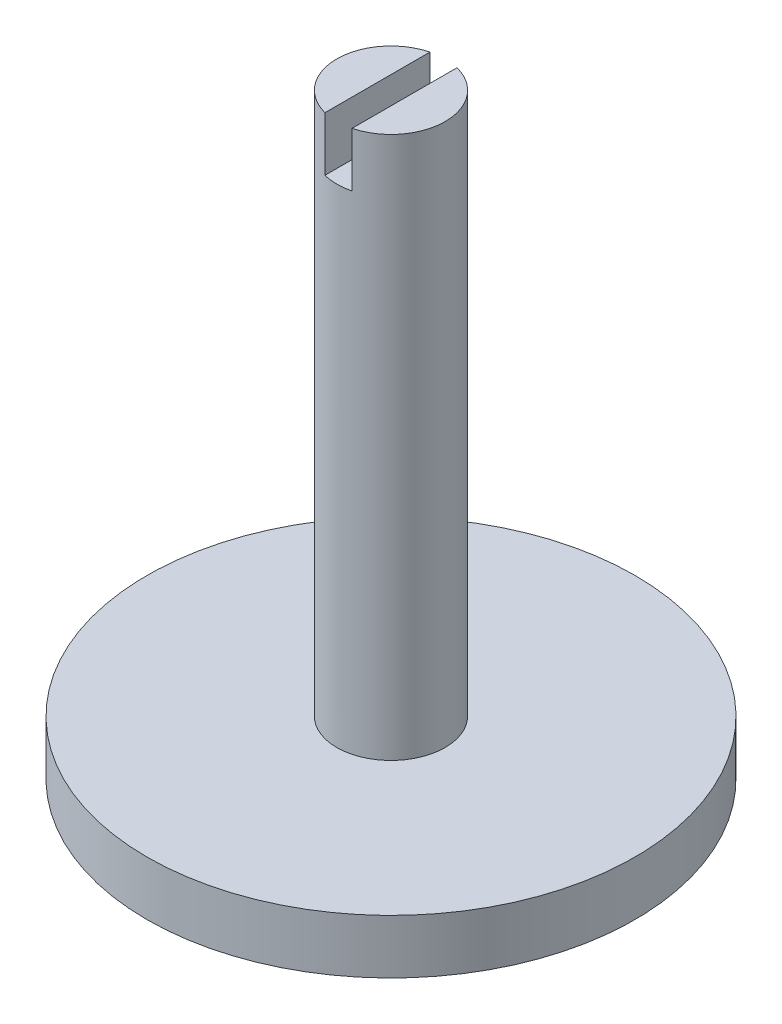
ISO-10303-21;
HEADER;
FILE_DESCRIPTION(('STEP AP214'),'2;1');
FILE_NAME('part.step','',(''),(''),'','','');
FILE_SCHEMA(('AUTOMOTIVE_DESIGN { 1 0 10303 214 1 1 1 1 }'));
ENDSEC;
DATA;
#1=APPLICATION_CONTEXT('core data for automotive mechanical design processes');
#2=APPLICATION_PROTOCOL_DEFINITION('international standard','automotive_design',2000,#1);
#3=PRODUCT_CONTEXT('',#1,'mechanical');
#4=PRODUCT('Part','Part','',(#3));
#5=PRODUCT_RELATED_PRODUCT_CATEGORY('part','',(#4));
#6=PRODUCT_DEFINITION_FORMATION('','',#4);
#7=PRODUCT_DEFINITION_CONTEXT('part definition',#1,'design');
#8=PRODUCT_DEFINITION('design','',#6,#7);
#9=PRODUCT_DEFINITION_SHAPE('','',#8);
#10=(LENGTH_UNIT() NAMED_UNIT(*) SI_UNIT(.MILLI.,.METRE.));
#11=(NAMED_UNIT(*) PLANE_ANGLE_UNIT() SI_UNIT($,.RADIAN.));
#12=(NAMED_UNIT(*) SI_UNIT($,.STERADIAN.) SOLID_ANGLE_UNIT());
#13=UNCERTAINTY_MEASURE_WITH_UNIT(LENGTH_MEASURE(1.E-05),#10,'distance_accuracy_value','');
#14=(GEOMETRIC_REPRESENTATION_CONTEXT(3) GLOBAL_UNCERTAINTY_ASSIGNED_CONTEXT((#13)) GLOBAL_UNIT_ASSIGNED_CONTEXT((#10,
#11,#12)) REPRESENTATION_CONTEXT('',''));
#15=CARTESIAN_POINT('',(0.,0.,0.));
#16=DIRECTION('',(0.,0.,1.));
#17=DIRECTION('',(1.,0.,0.));
#18=AXIS2_PLACEMENT_3D('',#15,#16,#17);
#19=CARTESIAN_POINT('',(0.,139.7,0.));
#20=DIRECTION('',(0.,1.,0.));
#21=DIRECTION('',(0.,0.,1.));
#22=AXIS2_PLACEMENT_3D('',#19,#20,#21);
#23=PLANE('',#22);
#24=DIRECTION('',(0.,0.,1.));
#25=VECTOR('',#24,1.);
#26=CARTESIAN_POINT('',(-3.175,139.7,0.));
#27=LINE('',#26,#25);
#28=CARTESIAN_POINT('',(-3.175,139.7,-12.2967221242086));
#29=VERTEX_POINT('',#28);
#30=CARTESIAN_POINT('',(-3.175,139.7,12.2967221242085));
#31=VERTEX_POINT('',#30);
#32=EDGE_CURVE('E60',#29,#31,#27,.T.);
#33=ORIENTED_EDGE('',*,*,#32,.F.);
#34=CARTESIAN_POINT('',(0.,139.7,0.));
#35=DIRECTION('',(0.,1.,0.));
#36=DIRECTION('',(0.,0.,1.));
#37=AXIS2_PLACEMENT_3D('',#34,#35,#36);
#38=CIRCLE('',#37,12.7);
#39=EDGE_CURVE('E109',#29,#31,#38,.T.);
#40=ORIENTED_EDGE('',*,*,#39,.T.);
#41=EDGE_LOOP('',(#33,#40));
#42=FACE_BOUND('',#41,.T.);
#43=ADVANCED_FACE('F37',(#42),#23,.T.);
#44=CARTESIAN_POINT('',(0.,12.7,0.));
#45=DIRECTION('',(0.,-1.,0.));
#46=DIRECTION('',(0.,0.,-1.));
#47=AXIS2_PLACEMENT_3D('',#44,#45,#46);
#48=CYLINDRICAL_SURFACE('',#47,57.15);
#49=CARTESIAN_POINT('',(0.,12.7,0.));
#50=DIRECTION('',(0.,1.,0.));
#51=DIRECTION('',(0.,0.,1.));
#52=AXIS2_PLACEMENT_3D('',#49,#50,#51);
#53=CIRCLE('',#52,57.15);
#54=CARTESIAN_POINT('',(0.,12.7,57.15));
#55=VERTEX_POINT('',#54);
#56=EDGE_CURVE('E118',#55,#55,#53,.T.);
#57=ORIENTED_EDGE('',*,*,#56,.F.);
#58=EDGE_LOOP('',(#57));
#59=FACE_BOUND('',#58,.T.);
#60=CARTESIAN_POINT('',(0.,0.,0.));
#61=DIRECTION('',(0.,1.,0.));
#62=DIRECTION('',(0.,0.,1.));
#63=AXIS2_PLACEMENT_3D('',#60,#61,#62);
#64=CIRCLE('',#63,57.15);
#65=CARTESIAN_POINT('',(0.,0.,57.15));
#66=VERTEX_POINT('',#65);
#67=EDGE_CURVE('E113',#66,#66,#64,.T.);
#68=ORIENTED_EDGE('',*,*,#67,.T.);
#69=EDGE_LOOP('',(#68));
#70=FACE_BOUND('',#69,.T.);
#71=ADVANCED_FACE('F39',(#59,#70),#48,.T.);
#72=CARTESIAN_POINT('',(0.,12.7,0.));
#73=DIRECTION('',(0.,1.,0.));
#74=DIRECTION('',(0.,0.,1.));
#75=AXIS2_PLACEMENT_3D('',#72,#73,#74);
#76=PLANE('',#75);
#77=CARTESIAN_POINT('',(0.,12.7,0.));
#78=DIRECTION('',(0.,1.,0.));
#79=DIRECTION('',(0.,0.,1.));
#80=AXIS2_PLACEMENT_3D('',#77,#78,#79);
#81=CIRCLE('',#80,12.7);
#82=CARTESIAN_POINT('',(0.,12.7,12.7));
#83=VERTEX_POINT('',#82);
#84=EDGE_CURVE('E114',#83,#83,#81,.T.);
#85=ORIENTED_EDGE('',*,*,#84,.F.);
#86=EDGE_LOOP('',(#85));
#87=FACE_BOUND('',#86,.T.);
#88=ORIENTED_EDGE('',*,*,#56,.T.);
#89=EDGE_LOOP('',(#88));
#90=FACE_BOUND('',#89,.T.);
#91=ADVANCED_FACE('F142',(#87,#90),#76,.T.);
#92=CARTESIAN_POINT('',(0.,0.,0.));
#93=DIRECTION('',(0.,1.,0.));
#94=DIRECTION('',(0.,0.,1.));
#95=AXIS2_PLACEMENT_3D('',#92,#93,#94);
#96=PLANE('',#95);
#97=CARTESIAN_POINT('',(0.,0.,0.));
#98=DIRECTION('',(0.,-1.,0.));
#99=DIRECTION('',(0.,0.,-1.));
#100=AXIS2_PLACEMENT_3D('',#97,#98,#99);
#101=CIRCLE('',#100,4.33069999999999);
#102=CARTESIAN_POINT('',(0.,0.,-4.33069999999999));
#103=VERTEX_POINT('',#102);
#104=EDGE_CURVE('E91',#103,#103,#101,.T.);
#105=ORIENTED_EDGE('',*,*,#104,.F.);
#106=EDGE_LOOP('',(#105));
#107=FACE_BOUND('',#106,.T.);
#108=ORIENTED_EDGE('',*,*,#67,.F.);
#109=EDGE_LOOP('',(#108));
#110=FACE_BOUND('',#109,.T.);
#111=ADVANCED_FACE('F153',(#107,#110),#96,.F.);
#112=CARTESIAN_POINT('',(0.,139.7,0.));
#113=DIRECTION('',(0.,-1.,0.));
#114=DIRECTION('',(0.,0.,-1.));
#115=AXIS2_PLACEMENT_3D('',#112,#113,#114);
#116=CYLINDRICAL_SURFACE('',#115,12.7);
#117=CARTESIAN_POINT('',(0.,127.,0.));
#118=DIRECTION('',(0.,-1.,0.));
#119=DIRECTION('',(0.,0.,-1.));
#120=AXIS2_PLACEMENT_3D('',#117,#118,#119);
#121=CIRCLE('',#120,12.7);
#122=CARTESIAN_POINT('',(3.175,127.,12.2967221242085));
#123=VERTEX_POINT('',#122);
#124=CARTESIAN_POINT('',(-3.175,127.,12.2967221242085));
#125=VERTEX_POINT('',#124);
#126=EDGE_CURVE('E11',#123,#125,#121,.T.);
#127=ORIENTED_EDGE('',*,*,#126,.T.);
#128=DIRECTION('',(0.,-1.,0.));
#129=VECTOR('',#128,1.);
#130=CARTESIAN_POINT('',(-3.175,139.7,12.2967221242085));
#131=LINE('',#130,#129);
#132=EDGE_CURVE('E104',#125,#31,#131,.F.);
#133=ORIENTED_EDGE('',*,*,#132,.T.);
#134=ORIENTED_EDGE('',*,*,#39,.F.);
#135=DIRECTION('',(0.,-1.,0.));
#136=VECTOR('',#135,1.);
#137=CARTESIAN_POINT('',(-3.175,139.7,-12.2967221242085));
#138=LINE('',#137,#136);
#139=CARTESIAN_POINT('',(-3.175,127.,-12.2967221242085));
#140=VERTEX_POINT('',#139);
#141=EDGE_CURVE('E106',#29,#140,#138,.T.);
#142=ORIENTED_EDGE('',*,*,#141,.T.);
#143=CARTESIAN_POINT('',(3.175,127.,-12.2967221242085));
#144=VERTEX_POINT('',#143);
#145=EDGE_CURVE('E41',#140,#144,#121,.T.);
#146=ORIENTED_EDGE('',*,*,#145,.T.);
#147=DIRECTION('',(0.,-1.,0.));
#148=VECTOR('',#147,1.);
#149=CARTESIAN_POINT('',(3.175,139.7,-12.2967221242085));
#150=LINE('',#149,#148);
#151=CARTESIAN_POINT('',(3.175,139.7,-12.2967221242086));
#152=VERTEX_POINT('',#151);
#153=EDGE_CURVE('E99',#144,#152,#150,.F.);
#154=ORIENTED_EDGE('',*,*,#153,.T.);
#155=CARTESIAN_POINT('',(3.175,139.7,12.2967221242085));
#156=VERTEX_POINT('',#155);
#157=EDGE_CURVE('E110',#156,#152,#38,.T.);
#158=ORIENTED_EDGE('',*,*,#157,.F.);
#159=DIRECTION('',(0.,-1.,0.));
#160=VECTOR('',#159,1.);
#161=CARTESIAN_POINT('',(3.175,139.7,12.2967221242085));
#162=LINE('',#161,#160);
#163=EDGE_CURVE('E52',#156,#123,#162,.T.);
#164=ORIENTED_EDGE('',*,*,#163,.T.);
#165=EDGE_LOOP('',(#127,#133,#134,#142,#146,#154,#158,#164));
#166=FACE_BOUND('',#165,.T.);
#167=ORIENTED_EDGE('',*,*,#84,.T.);
#168=EDGE_LOOP('',(#167));
#169=FACE_BOUND('',#168,.T.);
#170=ADVANCED_FACE('F125',(#166,#169),#116,.T.);
#171=DIRECTION('',(0.,0.,-1.));
#172=VECTOR('',#171,1.);
#173=CARTESIAN_POINT('',(3.175,139.7,0.));
#174=LINE('',#173,#172);
#175=EDGE_CURVE('E117',#156,#152,#174,.T.);
#176=ORIENTED_EDGE('',*,*,#175,.F.);
#177=ORIENTED_EDGE('',*,*,#157,.T.);
#178=EDGE_LOOP('',(#176,#177));
#179=FACE_BOUND('',#178,.T.);
#180=ADVANCED_FACE('F138',(#179),#23,.T.);
#181=CARTESIAN_POINT('',(-3.175,127.,-57.15));
#182=DIRECTION('',(0.,-1.,0.));
#183=DIRECTION('',(0.,0.,-1.));
#184=AXIS2_PLACEMENT_3D('',#181,#182,#183);
#185=PLANE('',#184);
#186=DIRECTION('',(0.,0.,1.));
#187=VECTOR('',#186,1.);
#188=CARTESIAN_POINT('',(3.175,127.,-57.15));
#189=LINE('',#188,#187);
#190=EDGE_CURVE('E94',#144,#123,#189,.T.);
#191=ORIENTED_EDGE('',*,*,#190,.F.);
#192=ORIENTED_EDGE('',*,*,#145,.F.);
#193=DIRECTION('',(0.,0.,1.));
#194=VECTOR('',#193,1.);
#195=CARTESIAN_POINT('',(-3.175,127.,-57.15));
#196=LINE('',#195,#194);
#197=EDGE_CURVE('E90',#140,#125,#196,.T.);
#198=ORIENTED_EDGE('',*,*,#197,.T.);
#199=ORIENTED_EDGE('',*,*,#126,.F.);
#200=EDGE_LOOP('',(#191,#192,#198,#199));
#201=FACE_BOUND('',#200,.T.);
#202=ADVANCED_FACE('F132',(#201),#185,.F.);
#203=CARTESIAN_POINT('',(-3.175,139.7,-57.15));
#204=DIRECTION('',(-1.,0.,0.));
#205=DIRECTION('',(0.,-1.,0.));
#206=AXIS2_PLACEMENT_3D('',#203,#204,#205);
#207=PLANE('',#206);
#208=ORIENTED_EDGE('',*,*,#32,.T.);
#209=ORIENTED_EDGE('',*,*,#132,.F.);
#210=ORIENTED_EDGE('',*,*,#197,.F.);
#211=ORIENTED_EDGE('',*,*,#141,.F.);
#212=EDGE_LOOP('',(#208,#209,#210,#211));
#213=FACE_BOUND('',#212,.T.);
#214=ADVANCED_FACE('F133',(#213),#207,.F.);
#215=CARTESIAN_POINT('',(3.175,139.7,-57.15));
#216=DIRECTION('',(1.,0.,0.));
#217=DIRECTION('',(0.,1.,0.));
#218=AXIS2_PLACEMENT_3D('',#215,#216,#217);
#219=PLANE('',#218);
#220=ORIENTED_EDGE('',*,*,#175,.T.);
#221=ORIENTED_EDGE('',*,*,#153,.F.);
#222=ORIENTED_EDGE('',*,*,#190,.T.);
#223=ORIENTED_EDGE('',*,*,#163,.F.);
#224=EDGE_LOOP('',(#220,#221,#222,#223));
#225=FACE_BOUND('',#224,.T.);
#226=ADVANCED_FACE('F84',(#225),#219,.F.);
#227=CARTESIAN_POINT('',(0.,22.7978529171773,0.));
#228=DIRECTION('',(0.,-1.,0.));
#229=DIRECTION('',(0.,0.,-1.));
#230=AXIS2_PLACEMENT_3D('',#227,#228,#229);
#231=CONICAL_SURFACE('',#230,4.33069999999999,1.02974425867665);
#232=CARTESIAN_POINT('',(0.,25.4,0.));
#233=VERTEX_POINT('',#232);
#234=VERTEX_LOOP('',#233);
#235=FACE_BOUND('',#234,.T.);
#236=CARTESIAN_POINT('',(0.,22.7978529171773,0.));
#237=DIRECTION('',(0.,-1.,0.));
#238=DIRECTION('',(0.,0.,-1.));
#239=AXIS2_PLACEMENT_3D('',#236,#237,#238);
#240=CIRCLE('',#239,4.33069999999999);
#241=CARTESIAN_POINT('',(0.,22.7978529171773,-4.33069999999999));
#242=VERTEX_POINT('',#241);
#243=EDGE_CURVE('E88',#242,#242,#240,.T.);
#244=ORIENTED_EDGE('',*,*,#243,.T.);
#245=EDGE_LOOP('',(#244));
#246=FACE_BOUND('',#245,.T.);
#247=ADVANCED_FACE('F80',(#235,#246),#231,.F.);
#248=CARTESIAN_POINT('',(0.,0.,0.));
#249=DIRECTION('',(0.,-1.,0.));
#250=DIRECTION('',(0.,0.,-1.));
#251=AXIS2_PLACEMENT_3D('',#248,#249,#250);
#252=CYLINDRICAL_SURFACE('',#251,4.33069999999999);
#253=ORIENTED_EDGE('',*,*,#243,.F.);
#254=EDGE_LOOP('',(#253));
#255=FACE_BOUND('',#254,.T.);
#256=ORIENTED_EDGE('',*,*,#104,.T.);
#257=EDGE_LOOP('',(#256));
#258=FACE_BOUND('',#257,.T.);
#259=ADVANCED_FACE('F83',(#255,#258),#252,.F.);
#260=CLOSED_SHELL('',(#43,#71,#91,#111,#170,#180,#202,#214,#226,#247,#259));
#261=MANIFOLD_SOLID_BREP('B2',#260);
#262=ADVANCED_BREP_SHAPE_REPRESENTATION('',(#18,#261),#14);
#263=SHAPE_DEFINITION_REPRESENTATION(#9,#262);
ENDSEC;
END-ISO-10303-21;
